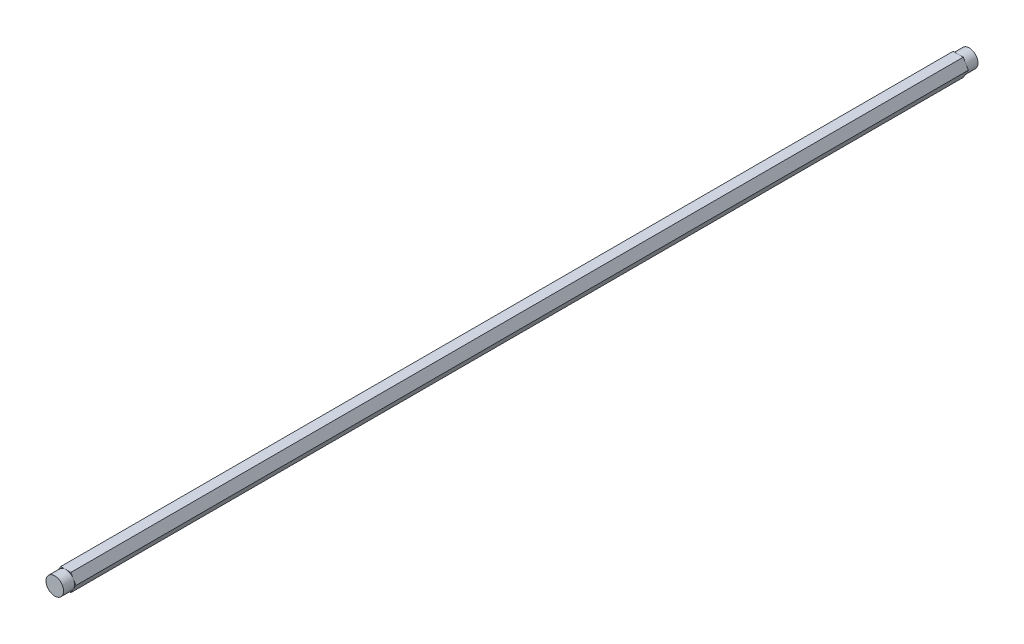
ISO-10303-21;
HEADER;
FILE_DESCRIPTION(('STEP AP214'),'2;1');
FILE_NAME('part.step','',(''),(''),'','','');
FILE_SCHEMA(('AUTOMOTIVE_DESIGN { 1 0 10303 214 1 1 1 1 }'));
ENDSEC;
DATA;
#1=APPLICATION_CONTEXT('core data for automotive mechanical design processes');
#2=APPLICATION_PROTOCOL_DEFINITION('international standard','automotive_design',2000,#1);
#3=PRODUCT_CONTEXT('',#1,'mechanical');
#4=PRODUCT('Part','Part','',(#3));
#5=PRODUCT_RELATED_PRODUCT_CATEGORY('part','',(#4));
#6=PRODUCT_DEFINITION_FORMATION('','',#4);
#7=PRODUCT_DEFINITION_CONTEXT('part definition',#1,'design');
#8=PRODUCT_DEFINITION('design','',#6,#7);
#9=PRODUCT_DEFINITION_SHAPE('','',#8);
#10=(LENGTH_UNIT() NAMED_UNIT(*) SI_UNIT(.MILLI.,.METRE.));
#11=(NAMED_UNIT(*) PLANE_ANGLE_UNIT() SI_UNIT($,.RADIAN.));
#12=(NAMED_UNIT(*) SI_UNIT($,.STERADIAN.) SOLID_ANGLE_UNIT());
#13=UNCERTAINTY_MEASURE_WITH_UNIT(LENGTH_MEASURE(1.E-05),#10,'distance_accuracy_value','');
#14=(GEOMETRIC_REPRESENTATION_CONTEXT(3) GLOBAL_UNCERTAINTY_ASSIGNED_CONTEXT((#13)) GLOBAL_UNIT_ASSIGNED_CONTEXT((#10,
#11,#12)) REPRESENTATION_CONTEXT('',''));
#15=CARTESIAN_POINT('',(0.,0.,0.));
#16=DIRECTION('',(0.,0.,1.));
#17=DIRECTION('',(1.,0.,0.));
#18=AXIS2_PLACEMENT_3D('',#15,#16,#17);
#19=CARTESIAN_POINT('',(0.,-6.35,330.2));
#20=DIRECTION('',(0.,1.,0.));
#21=DIRECTION('',(-1.,0.,0.));
#22=AXIS2_PLACEMENT_3D('',#19,#20,#21);
#23=PLANE('',#22);
#24=DIRECTION('',(-1.,0.,0.));
#25=VECTOR('',#24,1.);
#26=CARTESIAN_POINT('',(0.,-6.35,-322.2498));
#27=LINE('',#26,#25);
#28=CARTESIAN_POINT('',(3.66617420935412,-6.35,-322.2498));
#29=VERTEX_POINT('',#28);
#30=CARTESIAN_POINT('',(0.,-6.35,-322.2498));
#31=VERTEX_POINT('',#30);
#32=EDGE_CURVE('E315',#29,#31,#27,.T.);
#33=ORIENTED_EDGE('',*,*,#32,.F.);
#34=DIRECTION('',(0.,0.,-1.));
#35=VECTOR('',#34,1.);
#36=CARTESIAN_POINT('',(3.66617420935412,-6.35,330.2));
#37=LINE('',#36,#35);
#38=CARTESIAN_POINT('',(3.66617420935412,-6.35,322.2498));
#39=VERTEX_POINT('',#38);
#40=EDGE_CURVE('E228',#39,#29,#37,.T.);
#41=ORIENTED_EDGE('',*,*,#40,.F.);
#42=DIRECTION('',(1.,0.,0.));
#43=VECTOR('',#42,1.);
#44=CARTESIAN_POINT('',(0.,-6.35,322.2498));
#45=LINE('',#44,#43);
#46=CARTESIAN_POINT('',(0.,-6.35,322.2498));
#47=VERTEX_POINT('',#46);
#48=EDGE_CURVE('E207',#47,#39,#45,.T.);
#49=ORIENTED_EDGE('',*,*,#48,.F.);
#50=CARTESIAN_POINT('',(-3.66617420935412,-6.35,322.2498));
#51=VERTEX_POINT('',#50);
#52=EDGE_CURVE('E210',#51,#47,#45,.T.);
#53=ORIENTED_EDGE('',*,*,#52,.F.);
#54=DIRECTION('',(0.,0.,-1.));
#55=VECTOR('',#54,1.);
#56=CARTESIAN_POINT('',(-3.66617420935412,-6.35,330.2));
#57=LINE('',#56,#55);
#58=CARTESIAN_POINT('',(-3.66617420935412,-6.35,-322.2498));
#59=VERTEX_POINT('',#58);
#60=EDGE_CURVE('E211',#51,#59,#57,.T.);
#61=ORIENTED_EDGE('',*,*,#60,.T.);
#62=EDGE_CURVE('E305',#31,#59,#27,.T.);
#63=ORIENTED_EDGE('',*,*,#62,.F.);
#64=EDGE_LOOP('',(#33,#41,#49,#53,#61,#63));
#65=FACE_BOUND('',#64,.T.);
#66=ADVANCED_FACE('F49',(#65),#23,.F.);
#67=CARTESIAN_POINT('',(5.49926131403119,-3.175,330.2));
#68=DIRECTION('',(-0.866025403784439,0.5,0.));
#69=DIRECTION('',(-0.5,-0.866025403784439,0.));
#70=AXIS2_PLACEMENT_3D('',#67,#68,#69);
#71=PLANE('',#70);
#72=DIRECTION('',(-0.5,-0.866025403784439,0.));
#73=VECTOR('',#72,1.);
#74=CARTESIAN_POINT('',(5.49926131403119,-3.175,-322.2498));
#75=LINE('',#74,#73);
#76=CARTESIAN_POINT('',(7.33234841870825,0.,-322.2498));
#77=VERTEX_POINT('',#76);
#78=CARTESIAN_POINT('',(5.49926131403119,-3.175,-322.2498));
#79=VERTEX_POINT('',#78);
#80=EDGE_CURVE('E160',#77,#79,#75,.T.);
#81=ORIENTED_EDGE('',*,*,#80,.F.);
#82=DIRECTION('',(0.,0.,-1.));
#83=VECTOR('',#82,1.);
#84=CARTESIAN_POINT('',(7.33234841870825,0.,330.2));
#85=LINE('',#84,#83);
#86=CARTESIAN_POINT('',(7.33234841870825,0.,322.2498));
#87=VERTEX_POINT('',#86);
#88=EDGE_CURVE('E178',#87,#77,#85,.T.);
#89=ORIENTED_EDGE('',*,*,#88,.F.);
#90=DIRECTION('',(0.5,0.866025403784439,0.));
#91=VECTOR('',#90,1.);
#92=CARTESIAN_POINT('',(5.49926131403119,-3.175,322.2498));
#93=LINE('',#92,#91);
#94=CARTESIAN_POINT('',(5.49926131403119,-3.175,322.2498));
#95=VERTEX_POINT('',#94);
#96=EDGE_CURVE('E203',#95,#87,#93,.T.);
#97=ORIENTED_EDGE('',*,*,#96,.F.);
#98=EDGE_CURVE('E206',#39,#95,#93,.T.);
#99=ORIENTED_EDGE('',*,*,#98,.F.);
#100=ORIENTED_EDGE('',*,*,#40,.T.);
#101=EDGE_CURVE('E185',#79,#29,#75,.T.);
#102=ORIENTED_EDGE('',*,*,#101,.F.);
#103=EDGE_LOOP('',(#81,#89,#97,#99,#100,#102));
#104=FACE_BOUND('',#103,.T.);
#105=ADVANCED_FACE('F326',(#104),#71,.F.);
#106=CARTESIAN_POINT('',(5.49926131403119,3.175,330.2));
#107=DIRECTION('',(-0.866025403784438,-0.5,0.));
#108=DIRECTION('',(0.5,-0.866025403784439,0.));
#109=AXIS2_PLACEMENT_3D('',#106,#107,#108);
#110=PLANE('',#109);
#111=DIRECTION('',(0.5,-0.866025403784439,0.));
#112=VECTOR('',#111,1.);
#113=CARTESIAN_POINT('',(5.49926131403119,3.175,-322.2498));
#114=LINE('',#113,#112);
#115=CARTESIAN_POINT('',(3.66617420935412,6.35,-322.2498));
#116=VERTEX_POINT('',#115);
#117=CARTESIAN_POINT('',(5.49926131403118,3.175,-322.2498));
#118=VERTEX_POINT('',#117);
#119=EDGE_CURVE('E140',#116,#118,#114,.T.);
#120=ORIENTED_EDGE('',*,*,#119,.F.);
#121=DIRECTION('',(0.,0.,-1.));
#122=VECTOR('',#121,1.);
#123=CARTESIAN_POINT('',(3.66617420935412,6.35,330.2));
#124=LINE('',#123,#122);
#125=CARTESIAN_POINT('',(3.66617420935412,6.35,322.2498));
#126=VERTEX_POINT('',#125);
#127=EDGE_CURVE('E223',#126,#116,#124,.T.);
#128=ORIENTED_EDGE('',*,*,#127,.F.);
#129=DIRECTION('',(-0.5,0.866025403784439,0.));
#130=VECTOR('',#129,1.);
#131=CARTESIAN_POINT('',(5.49926131403119,3.175,322.2498));
#132=LINE('',#131,#130);
#133=CARTESIAN_POINT('',(5.49926131403118,3.175,322.2498));
#134=VERTEX_POINT('',#133);
#135=EDGE_CURVE('E199',#134,#126,#132,.T.);
#136=ORIENTED_EDGE('',*,*,#135,.F.);
#137=EDGE_CURVE('E202',#87,#134,#132,.T.);
#138=ORIENTED_EDGE('',*,*,#137,.F.);
#139=ORIENTED_EDGE('',*,*,#88,.T.);
#140=EDGE_CURVE('E153',#118,#77,#114,.T.);
#141=ORIENTED_EDGE('',*,*,#140,.F.);
#142=EDGE_LOOP('',(#120,#128,#136,#138,#139,#141));
#143=FACE_BOUND('',#142,.T.);
#144=ADVANCED_FACE('F175',(#143),#110,.F.);
#145=CARTESIAN_POINT('',(0.,6.35,330.2));
#146=DIRECTION('',(0.,-1.,0.));
#147=DIRECTION('',(1.,0.,0.));
#148=AXIS2_PLACEMENT_3D('',#145,#146,#147);
#149=PLANE('',#148);
#150=DIRECTION('',(1.,0.,0.));
#151=VECTOR('',#150,1.);
#152=CARTESIAN_POINT('',(0.,6.35,-322.2498));
#153=LINE('',#152,#151);
#154=CARTESIAN_POINT('',(-3.66617420935412,6.35,-322.2498));
#155=VERTEX_POINT('',#154);
#156=CARTESIAN_POINT('',(0.,6.35,-322.2498));
#157=VERTEX_POINT('',#156);
#158=EDGE_CURVE('E182',#155,#157,#153,.T.);
#159=ORIENTED_EDGE('',*,*,#158,.F.);
#160=DIRECTION('',(0.,0.,-1.));
#161=VECTOR('',#160,1.);
#162=CARTESIAN_POINT('',(-3.66617420935412,6.35,330.2));
#163=LINE('',#162,#161);
#164=CARTESIAN_POINT('',(-3.66617420935412,6.35,322.2498));
#165=VERTEX_POINT('',#164);
#166=EDGE_CURVE('E219',#165,#155,#163,.T.);
#167=ORIENTED_EDGE('',*,*,#166,.F.);
#168=DIRECTION('',(-1.,0.,0.));
#169=VECTOR('',#168,1.);
#170=CARTESIAN_POINT('',(0.,6.35,322.2498));
#171=LINE('',#170,#169);
#172=CARTESIAN_POINT('',(0.,6.35,322.2498));
#173=VERTEX_POINT('',#172);
#174=EDGE_CURVE('E195',#173,#165,#171,.T.);
#175=ORIENTED_EDGE('',*,*,#174,.F.);
#176=EDGE_CURVE('E198',#126,#173,#171,.T.);
#177=ORIENTED_EDGE('',*,*,#176,.F.);
#178=ORIENTED_EDGE('',*,*,#127,.T.);
#179=EDGE_CURVE('E146',#157,#116,#153,.T.);
#180=ORIENTED_EDGE('',*,*,#179,.F.);
#181=EDGE_LOOP('',(#159,#167,#175,#177,#178,#180));
#182=FACE_BOUND('',#181,.T.);
#183=ADVANCED_FACE('F293',(#182),#149,.F.);
#184=CARTESIAN_POINT('',(-5.49926131403118,3.175,330.2));
#185=DIRECTION('',(0.866025403784439,-0.5,0.));
#186=DIRECTION('',(0.5,0.866025403784439,0.));
#187=AXIS2_PLACEMENT_3D('',#184,#185,#186);
#188=PLANE('',#187);
#189=DIRECTION('',(0.5,0.866025403784439,0.));
#190=VECTOR('',#189,1.);
#191=CARTESIAN_POINT('',(-5.49926131403118,3.175,-322.2498));
#192=LINE('',#191,#190);
#193=CARTESIAN_POINT('',(-7.33234841870824,0.,-322.2498));
#194=VERTEX_POINT('',#193);
#195=CARTESIAN_POINT('',(-5.49926131403119,3.175,-322.2498));
#196=VERTEX_POINT('',#195);
#197=EDGE_CURVE('E173',#194,#196,#192,.T.);
#198=ORIENTED_EDGE('',*,*,#197,.F.);
#199=DIRECTION('',(0.,0.,-1.));
#200=VECTOR('',#199,1.);
#201=CARTESIAN_POINT('',(-7.33234841870824,0.,330.2));
#202=LINE('',#201,#200);
#203=CARTESIAN_POINT('',(-7.33234841870824,0.,322.2498));
#204=VERTEX_POINT('',#203);
#205=EDGE_CURVE('E215',#204,#194,#202,.T.);
#206=ORIENTED_EDGE('',*,*,#205,.F.);
#207=DIRECTION('',(-0.5,-0.866025403784439,0.));
#208=VECTOR('',#207,1.);
#209=CARTESIAN_POINT('',(-5.49926131403118,3.175,322.2498));
#210=LINE('',#209,#208);
#211=CARTESIAN_POINT('',(-5.49926131403119,3.175,322.2498));
#212=VERTEX_POINT('',#211);
#213=EDGE_CURVE('E190',#212,#204,#210,.T.);
#214=ORIENTED_EDGE('',*,*,#213,.F.);
#215=EDGE_CURVE('E194',#165,#212,#210,.T.);
#216=ORIENTED_EDGE('',*,*,#215,.F.);
#217=ORIENTED_EDGE('',*,*,#166,.T.);
#218=EDGE_CURVE('E307',#196,#155,#192,.T.);
#219=ORIENTED_EDGE('',*,*,#218,.F.);
#220=EDGE_LOOP('',(#198,#206,#214,#216,#217,#219));
#221=FACE_BOUND('',#220,.T.);
#222=ADVANCED_FACE('F300',(#221),#188,.F.);
#223=CARTESIAN_POINT('',(-5.49926131403118,-3.175,330.2));
#224=DIRECTION('',(0.866025403784439,0.5,0.));
#225=DIRECTION('',(-0.5,0.866025403784439,0.));
#226=AXIS2_PLACEMENT_3D('',#223,#224,#225);
#227=PLANE('',#226);
#228=DIRECTION('',(-0.5,0.866025403784439,0.));
#229=VECTOR('',#228,1.);
#230=CARTESIAN_POINT('',(-5.49926131403118,-3.175,-322.2498));
#231=LINE('',#230,#229);
#232=CARTESIAN_POINT('',(-5.49926131403118,-3.175,-322.2498));
#233=VERTEX_POINT('',#232);
#234=EDGE_CURVE('E12',#59,#233,#231,.T.);
#235=ORIENTED_EDGE('',*,*,#234,.F.);
#236=ORIENTED_EDGE('',*,*,#60,.F.);
#237=DIRECTION('',(0.5,-0.866025403784439,0.));
#238=VECTOR('',#237,1.);
#239=CARTESIAN_POINT('',(-5.49926131403118,-3.175,322.2498));
#240=LINE('',#239,#238);
#241=CARTESIAN_POINT('',(-5.49926131403118,-3.175,322.2498));
#242=VERTEX_POINT('',#241);
#243=EDGE_CURVE('E236',#242,#51,#240,.T.);
#244=ORIENTED_EDGE('',*,*,#243,.F.);
#245=EDGE_CURVE('E238',#204,#242,#240,.T.);
#246=ORIENTED_EDGE('',*,*,#245,.F.);
#247=ORIENTED_EDGE('',*,*,#205,.T.);
#248=EDGE_CURVE('E52',#233,#194,#231,.T.);
#249=ORIENTED_EDGE('',*,*,#248,.F.);
#250=EDGE_LOOP('',(#235,#236,#244,#246,#247,#249));
#251=FACE_BOUND('',#250,.T.);
#252=ADVANCED_FACE('F256',(#251),#227,.F.);
#253=CARTESIAN_POINT('',(0.,0.,322.2498));
#254=DIRECTION('',(0.,0.,1.));
#255=DIRECTION('',(1.,0.,0.));
#256=AXIS2_PLACEMENT_3D('',#253,#254,#255);
#257=PLANE('',#256);
#258=ORIENTED_EDGE('',*,*,#52,.T.);
#259=CARTESIAN_POINT('',(0.,0.,322.2498));
#260=DIRECTION('',(0.,0.,1.));
#261=DIRECTION('',(1.,0.,0.));
#262=AXIS2_PLACEMENT_3D('',#259,#260,#261);
#263=CIRCLE('',#262,6.35);
#264=EDGE_CURVE('E261',#242,#47,#263,.T.);
#265=ORIENTED_EDGE('',*,*,#264,.F.);
#266=ORIENTED_EDGE('',*,*,#243,.T.);
#267=EDGE_LOOP('',(#258,#265,#266));
#268=FACE_BOUND('',#267,.T.);
#269=ADVANCED_FACE('F259',(#268),#257,.T.);
#270=ORIENTED_EDGE('',*,*,#48,.T.);
#271=ORIENTED_EDGE('',*,*,#98,.T.);
#272=EDGE_CURVE('E276',#47,#95,#263,.T.);
#273=ORIENTED_EDGE('',*,*,#272,.F.);
#274=EDGE_LOOP('',(#270,#271,#273));
#275=FACE_BOUND('',#274,.T.);
#276=ADVANCED_FACE('F328',(#275),#257,.T.);
#277=ORIENTED_EDGE('',*,*,#96,.T.);
#278=ORIENTED_EDGE('',*,*,#137,.T.);
#279=EDGE_CURVE('E152',#95,#134,#263,.T.);
#280=ORIENTED_EDGE('',*,*,#279,.F.);
#281=EDGE_LOOP('',(#277,#278,#280));
#282=FACE_BOUND('',#281,.T.);
#283=ADVANCED_FACE('F330',(#282),#257,.T.);
#284=ORIENTED_EDGE('',*,*,#135,.T.);
#285=ORIENTED_EDGE('',*,*,#176,.T.);
#286=EDGE_CURVE('E186',#134,#173,#263,.T.);
#287=ORIENTED_EDGE('',*,*,#286,.F.);
#288=EDGE_LOOP('',(#284,#285,#287));
#289=FACE_BOUND('',#288,.T.);
#290=ADVANCED_FACE('F288',(#289),#257,.T.);
#291=ORIENTED_EDGE('',*,*,#174,.T.);
#292=ORIENTED_EDGE('',*,*,#215,.T.);
#293=EDGE_CURVE('E191',#173,#212,#263,.T.);
#294=ORIENTED_EDGE('',*,*,#293,.F.);
#295=EDGE_LOOP('',(#291,#292,#294));
#296=FACE_BOUND('',#295,.T.);
#297=ADVANCED_FACE('F297',(#296),#257,.T.);
#298=ORIENTED_EDGE('',*,*,#213,.T.);
#299=ORIENTED_EDGE('',*,*,#245,.T.);
#300=EDGE_CURVE('E72',#212,#242,#263,.T.);
#301=ORIENTED_EDGE('',*,*,#300,.F.);
#302=EDGE_LOOP('',(#298,#299,#301));
#303=FACE_BOUND('',#302,.T.);
#304=ADVANCED_FACE('F250',(#303),#257,.T.);
#305=CARTESIAN_POINT('',(0.,0.,322.2498));
#306=DIRECTION('',(0.,0.,1.));
#307=DIRECTION('',(1.,0.,0.));
#308=AXIS2_PLACEMENT_3D('',#305,#306,#307);
#309=CYLINDRICAL_SURFACE('',#308,6.35);
#310=CARTESIAN_POINT('',(0.,0.,330.2));
#311=DIRECTION('',(0.,0.,1.));
#312=DIRECTION('',(1.,0.,0.));
#313=AXIS2_PLACEMENT_3D('',#310,#311,#312);
#314=CIRCLE('',#313,6.35);
#315=CARTESIAN_POINT('',(6.35,0.,330.2));
#316=VERTEX_POINT('',#315);
#317=EDGE_CURVE('E232',#316,#316,#314,.T.);
#318=ORIENTED_EDGE('',*,*,#317,.F.);
#319=EDGE_LOOP('',(#318));
#320=FACE_BOUND('',#319,.T.);
#321=ORIENTED_EDGE('',*,*,#264,.T.);
#322=ORIENTED_EDGE('',*,*,#272,.T.);
#323=ORIENTED_EDGE('',*,*,#279,.T.);
#324=ORIENTED_EDGE('',*,*,#286,.T.);
#325=ORIENTED_EDGE('',*,*,#293,.T.);
#326=ORIENTED_EDGE('',*,*,#300,.T.);
#327=EDGE_LOOP('',(#321,#322,#323,#324,#325,#326));
#328=FACE_BOUND('',#327,.T.);
#329=ADVANCED_FACE('F282',(#320,#328),#309,.T.);
#330=CARTESIAN_POINT('',(0.,0.,330.2));
#331=DIRECTION('',(0.,0.,1.));
#332=DIRECTION('',(1.,0.,0.));
#333=AXIS2_PLACEMENT_3D('',#330,#331,#332);
#334=PLANE('',#333);
#335=ORIENTED_EDGE('',*,*,#317,.T.);
#336=EDGE_LOOP('',(#335));
#337=FACE_BOUND('',#336,.T.);
#338=ADVANCED_FACE('F356',(#337),#334,.T.);
#339=CARTESIAN_POINT('',(0.,0.,-322.2498));
#340=DIRECTION('',(0.,0.,-1.));
#341=DIRECTION('',(-1.,0.,0.));
#342=AXIS2_PLACEMENT_3D('',#339,#340,#341);
#343=PLANE('',#342);
#344=ORIENTED_EDGE('',*,*,#119,.T.);
#345=CARTESIAN_POINT('',(0.,0.,-322.2498));
#346=DIRECTION('',(0.,0.,1.));
#347=DIRECTION('',(1.,0.,0.));
#348=AXIS2_PLACEMENT_3D('',#345,#346,#347);
#349=CIRCLE('',#348,6.35);
#350=EDGE_CURVE('E144',#118,#157,#349,.T.);
#351=ORIENTED_EDGE('',*,*,#350,.T.);
#352=ORIENTED_EDGE('',*,*,#179,.T.);
#353=EDGE_LOOP('',(#344,#351,#352));
#354=FACE_BOUND('',#353,.T.);
#355=ADVANCED_FACE('F142',(#354),#343,.T.);
#356=ORIENTED_EDGE('',*,*,#140,.T.);
#357=ORIENTED_EDGE('',*,*,#80,.T.);
#358=EDGE_CURVE('E157',#79,#118,#349,.T.);
#359=ORIENTED_EDGE('',*,*,#358,.T.);
#360=EDGE_LOOP('',(#356,#357,#359));
#361=FACE_BOUND('',#360,.T.);
#362=ADVANCED_FACE('F158',(#361),#343,.T.);
#363=ORIENTED_EDGE('',*,*,#101,.T.);
#364=ORIENTED_EDGE('',*,*,#32,.T.);
#365=EDGE_CURVE('E165',#31,#79,#349,.T.);
#366=ORIENTED_EDGE('',*,*,#365,.T.);
#367=EDGE_LOOP('',(#363,#364,#366));
#368=FACE_BOUND('',#367,.T.);
#369=ADVANCED_FACE('F379',(#368),#343,.T.);
#370=ORIENTED_EDGE('',*,*,#158,.T.);
#371=EDGE_CURVE('E171',#157,#196,#349,.T.);
#372=ORIENTED_EDGE('',*,*,#371,.T.);
#373=ORIENTED_EDGE('',*,*,#218,.T.);
#374=EDGE_LOOP('',(#370,#372,#373));
#375=FACE_BOUND('',#374,.T.);
#376=ADVANCED_FACE('F312',(#375),#343,.T.);
#377=ORIENTED_EDGE('',*,*,#62,.T.);
#378=ORIENTED_EDGE('',*,*,#234,.T.);
#379=EDGE_CURVE('E309',#233,#31,#349,.T.);
#380=ORIENTED_EDGE('',*,*,#379,.T.);
#381=EDGE_LOOP('',(#377,#378,#380));
#382=FACE_BOUND('',#381,.T.);
#383=ADVANCED_FACE('F321',(#382),#343,.T.);
#384=ORIENTED_EDGE('',*,*,#197,.T.);
#385=EDGE_CURVE('E64',#196,#233,#349,.T.);
#386=ORIENTED_EDGE('',*,*,#385,.T.);
#387=ORIENTED_EDGE('',*,*,#248,.T.);
#388=EDGE_LOOP('',(#384,#386,#387));
#389=FACE_BOUND('',#388,.T.);
#390=ADVANCED_FACE('F303',(#389),#343,.T.);
#391=CARTESIAN_POINT('',(0.,0.,-322.2498));
#392=DIRECTION('',(0.,0.,-1.));
#393=DIRECTION('',(-1.,0.,0.));
#394=AXIS2_PLACEMENT_3D('',#391,#392,#393);
#395=CYLINDRICAL_SURFACE('',#394,6.35);
#396=ORIENTED_EDGE('',*,*,#365,.F.);
#397=ORIENTED_EDGE('',*,*,#379,.F.);
#398=ORIENTED_EDGE('',*,*,#385,.F.);
#399=ORIENTED_EDGE('',*,*,#371,.F.);
#400=ORIENTED_EDGE('',*,*,#350,.F.);
#401=ORIENTED_EDGE('',*,*,#358,.F.);
#402=EDGE_LOOP('',(#396,#397,#398,#399,#400,#401));
#403=FACE_BOUND('',#402,.T.);
#404=CARTESIAN_POINT('',(0.,0.,-330.2));
#405=DIRECTION('',(0.,0.,1.));
#406=DIRECTION('',(1.,0.,0.));
#407=AXIS2_PLACEMENT_3D('',#404,#405,#406);
#408=CIRCLE('',#407,6.35);
#409=CARTESIAN_POINT('',(6.35,0.,-330.2));
#410=VERTEX_POINT('',#409);
#411=EDGE_CURVE('E239',#410,#410,#408,.F.);
#412=ORIENTED_EDGE('',*,*,#411,.F.);
#413=EDGE_LOOP('',(#412));
#414=FACE_BOUND('',#413,.T.);
#415=ADVANCED_FACE('F168',(#403,#414),#395,.T.);
#416=CARTESIAN_POINT('',(0.,0.,-330.2));
#417=DIRECTION('',(0.,0.,1.));
#418=DIRECTION('',(1.,0.,0.));
#419=AXIS2_PLACEMENT_3D('',#416,#417,#418);
#420=PLANE('',#419);
#421=ORIENTED_EDGE('',*,*,#411,.T.);
#422=EDGE_LOOP('',(#421));
#423=FACE_BOUND('',#422,.T.);
#424=ADVANCED_FACE('F354',(#423),#420,.F.);
#425=CLOSED_SHELL('',(#66,#105,#144,#183,#222,#252,#269,#276,#283,#290,#297,#304,#329,#338,#355,
#362,#369,#376,#383,#390,#415,#424));
#426=MANIFOLD_SOLID_BREP('B2',#425);
#427=ADVANCED_BREP_SHAPE_REPRESENTATION('',(#18,#426),#14);
#428=SHAPE_DEFINITION_REPRESENTATION(#9,#427);
ENDSEC;
END-ISO-10303-21;
